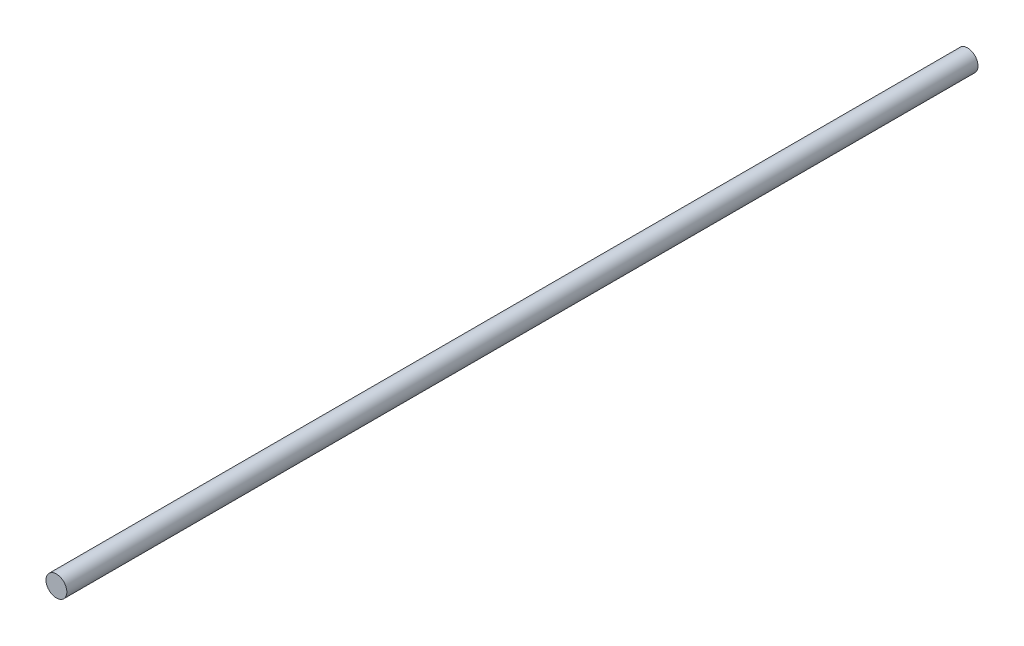
ISO-10303-21;
HEADER;
FILE_DESCRIPTION(('STEP AP214'),'2;1');
FILE_NAME('part.step','',(''),(''),'','','');
FILE_SCHEMA(('AUTOMOTIVE_DESIGN { 1 0 10303 214 1 1 1 1 }'));
ENDSEC;
DATA;
#1=APPLICATION_CONTEXT('core data for automotive mechanical design processes');
#2=APPLICATION_PROTOCOL_DEFINITION('international standard','automotive_design',2000,#1);
#3=PRODUCT_CONTEXT('',#1,'mechanical');
#4=PRODUCT('Part','Part','',(#3));
#5=PRODUCT_RELATED_PRODUCT_CATEGORY('part','',(#4));
#6=PRODUCT_DEFINITION_FORMATION('','',#4);
#7=PRODUCT_DEFINITION_CONTEXT('part definition',#1,'design');
#8=PRODUCT_DEFINITION('design','',#6,#7);
#9=PRODUCT_DEFINITION_SHAPE('','',#8);
#10=(LENGTH_UNIT() NAMED_UNIT(*) SI_UNIT(.MILLI.,.METRE.));
#11=(NAMED_UNIT(*) PLANE_ANGLE_UNIT() SI_UNIT($,.RADIAN.));
#12=(NAMED_UNIT(*) SI_UNIT($,.STERADIAN.) SOLID_ANGLE_UNIT());
#13=UNCERTAINTY_MEASURE_WITH_UNIT(LENGTH_MEASURE(1.E-05),#10,'distance_accuracy_value','');
#14=(GEOMETRIC_REPRESENTATION_CONTEXT(3) GLOBAL_UNCERTAINTY_ASSIGNED_CONTEXT((#13)) GLOBAL_UNIT_ASSIGNED_CONTEXT((#10,
#11,#12)) REPRESENTATION_CONTEXT('',''));
#15=CARTESIAN_POINT('',(0.,0.,0.));
#16=DIRECTION('',(0.,0.,1.));
#17=DIRECTION('',(1.,0.,0.));
#18=AXIS2_PLACEMENT_3D('',#15,#16,#17);
#19=CARTESIAN_POINT('',(0.,0.,1110.));
#20=DIRECTION('',(0.,0.,-1.));
#21=DIRECTION('',(-1.,0.,0.));
#22=AXIS2_PLACEMENT_3D('',#19,#20,#21);
#23=CYLINDRICAL_SURFACE('',#22,12.7);
#24=CARTESIAN_POINT('',(0.,0.,1110.));
#25=DIRECTION('',(0.,0.,1.));
#26=DIRECTION('',(1.,0.,0.));
#27=AXIS2_PLACEMENT_3D('',#24,#25,#26);
#28=CIRCLE('',#27,12.7);
#29=CARTESIAN_POINT('',(12.7,0.,1110.));
#30=VERTEX_POINT('',#29);
#31=EDGE_CURVE('E10',#30,#30,#28,.T.);
#32=ORIENTED_EDGE('',*,*,#31,.F.);
#33=EDGE_LOOP('',(#32));
#34=FACE_BOUND('',#33,.T.);
#35=CARTESIAN_POINT('',(0.,0.,0.));
#36=DIRECTION('',(0.,0.,1.));
#37=DIRECTION('',(1.,0.,0.));
#38=AXIS2_PLACEMENT_3D('',#35,#36,#37);
#39=CIRCLE('',#38,12.7);
#40=CARTESIAN_POINT('',(12.7,0.,0.));
#41=VERTEX_POINT('',#40);
#42=EDGE_CURVE('E34',#41,#41,#39,.T.);
#43=ORIENTED_EDGE('',*,*,#42,.T.);
#44=EDGE_LOOP('',(#43));
#45=FACE_BOUND('',#44,.T.);
#46=ADVANCED_FACE('F31',(#34,#45),#23,.T.);
#47=CARTESIAN_POINT('',(0.,0.,1110.));
#48=DIRECTION('',(0.,0.,1.));
#49=DIRECTION('',(1.,0.,0.));
#50=AXIS2_PLACEMENT_3D('',#47,#48,#49);
#51=PLANE('',#50);
#52=ORIENTED_EDGE('',*,*,#31,.T.);
#53=EDGE_LOOP('',(#52));
#54=FACE_BOUND('',#53,.T.);
#55=ADVANCED_FACE('F46',(#54),#51,.T.);
#56=CARTESIAN_POINT('',(0.,0.,0.));
#57=DIRECTION('',(0.,0.,1.));
#58=DIRECTION('',(1.,0.,0.));
#59=AXIS2_PLACEMENT_3D('',#56,#57,#58);
#60=PLANE('',#59);
#61=ORIENTED_EDGE('',*,*,#42,.F.);
#62=EDGE_LOOP('',(#61));
#63=FACE_BOUND('',#62,.T.);
#64=ADVANCED_FACE('F44',(#63),#60,.F.);
#65=CLOSED_SHELL('',(#46,#55,#64));
#66=MANIFOLD_SOLID_BREP('B2',#65);
#67=ADVANCED_BREP_SHAPE_REPRESENTATION('',(#18,#66),#14);
#68=SHAPE_DEFINITION_REPRESENTATION(#9,#67);
ENDSEC;
END-ISO-10303-21;
